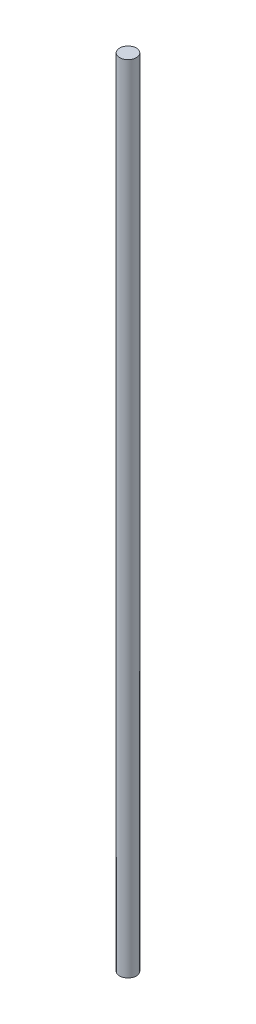
ISO-10303-21;
HEADER;
FILE_DESCRIPTION(('STEP AP214'),'2;1');
FILE_NAME('part.step','',(''),(''),'','','');
FILE_SCHEMA(('AUTOMOTIVE_DESIGN { 1 0 10303 214 1 1 1 1 }'));
ENDSEC;
DATA;
#1=APPLICATION_CONTEXT('core data for automotive mechanical design processes');
#2=APPLICATION_PROTOCOL_DEFINITION('international standard','automotive_design',2000,#1);
#3=PRODUCT_CONTEXT('',#1,'mechanical');
#4=PRODUCT('Part','Part','',(#3));
#5=PRODUCT_RELATED_PRODUCT_CATEGORY('part','',(#4));
#6=PRODUCT_DEFINITION_FORMATION('','',#4);
#7=PRODUCT_DEFINITION_CONTEXT('part definition',#1,'design');
#8=PRODUCT_DEFINITION('design','',#6,#7);
#9=PRODUCT_DEFINITION_SHAPE('','',#8);
#10=(LENGTH_UNIT() NAMED_UNIT(*) SI_UNIT(.MILLI.,.METRE.));
#11=(NAMED_UNIT(*) PLANE_ANGLE_UNIT() SI_UNIT($,.RADIAN.));
#12=(NAMED_UNIT(*) SI_UNIT($,.STERADIAN.) SOLID_ANGLE_UNIT());
#13=UNCERTAINTY_MEASURE_WITH_UNIT(LENGTH_MEASURE(1.E-05),#10,'distance_accuracy_value','');
#14=(GEOMETRIC_REPRESENTATION_CONTEXT(3) GLOBAL_UNCERTAINTY_ASSIGNED_CONTEXT((#13)) GLOBAL_UNIT_ASSIGNED_CONTEXT((#10,
#11,#12)) REPRESENTATION_CONTEXT('',''));
#15=CARTESIAN_POINT('',(0.,0.,0.));
#16=DIRECTION('',(0.,0.,1.));
#17=DIRECTION('',(1.,0.,0.));
#18=AXIS2_PLACEMENT_3D('',#15,#16,#17);
#19=CARTESIAN_POINT('',(0.,100.,0.));
#20=DIRECTION('',(0.,-1.,0.));
#21=DIRECTION('',(0.,0.,-1.));
#22=AXIS2_PLACEMENT_3D('',#19,#20,#21);
#23=CYLINDRICAL_SURFACE('',#22,1.05);
#24=CARTESIAN_POINT('',(0.,100.,0.));
#25=DIRECTION('',(0.,1.,0.));
#26=DIRECTION('',(0.,0.,1.));
#27=AXIS2_PLACEMENT_3D('',#24,#25,#26);
#28=CIRCLE('',#27,1.05);
#29=CARTESIAN_POINT('',(0.,100.,1.05));
#30=VERTEX_POINT('',#29);
#31=EDGE_CURVE('E10',#30,#30,#28,.T.);
#32=ORIENTED_EDGE('',*,*,#31,.F.);
#33=EDGE_LOOP('',(#32));
#34=FACE_BOUND('',#33,.T.);
#35=CARTESIAN_POINT('',(0.,0.,0.));
#36=DIRECTION('',(0.,1.,0.));
#37=DIRECTION('',(0.,0.,1.));
#38=AXIS2_PLACEMENT_3D('',#35,#36,#37);
#39=CIRCLE('',#38,1.05);
#40=CARTESIAN_POINT('',(0.,0.,1.05));
#41=VERTEX_POINT('',#40);
#42=EDGE_CURVE('E36',#41,#41,#39,.T.);
#43=ORIENTED_EDGE('',*,*,#42,.T.);
#44=EDGE_LOOP('',(#43));
#45=FACE_BOUND('',#44,.T.);
#46=ADVANCED_FACE('F33',(#34,#45),#23,.T.);
#47=CARTESIAN_POINT('',(0.,100.,0.));
#48=DIRECTION('',(0.,1.,0.));
#49=DIRECTION('',(0.,0.,1.));
#50=AXIS2_PLACEMENT_3D('',#47,#48,#49);
#51=PLANE('',#50);
#52=ORIENTED_EDGE('',*,*,#31,.T.);
#53=EDGE_LOOP('',(#52));
#54=FACE_BOUND('',#53,.T.);
#55=ADVANCED_FACE('F48',(#54),#51,.T.);
#56=CARTESIAN_POINT('',(0.,0.,0.));
#57=DIRECTION('',(0.,1.,0.));
#58=DIRECTION('',(0.,0.,1.));
#59=AXIS2_PLACEMENT_3D('',#56,#57,#58);
#60=PLANE('',#59);
#61=ORIENTED_EDGE('',*,*,#42,.F.);
#62=EDGE_LOOP('',(#61));
#63=FACE_BOUND('',#62,.T.);
#64=ADVANCED_FACE('F46',(#63),#60,.F.);
#65=CLOSED_SHELL('',(#46,#55,#64));
#66=MANIFOLD_SOLID_BREP('B2',#65);
#67=ADVANCED_BREP_SHAPE_REPRESENTATION('',(#18,#66),#14);
#68=SHAPE_DEFINITION_REPRESENTATION(#9,#67);
ENDSEC;
END-ISO-10303-21;
